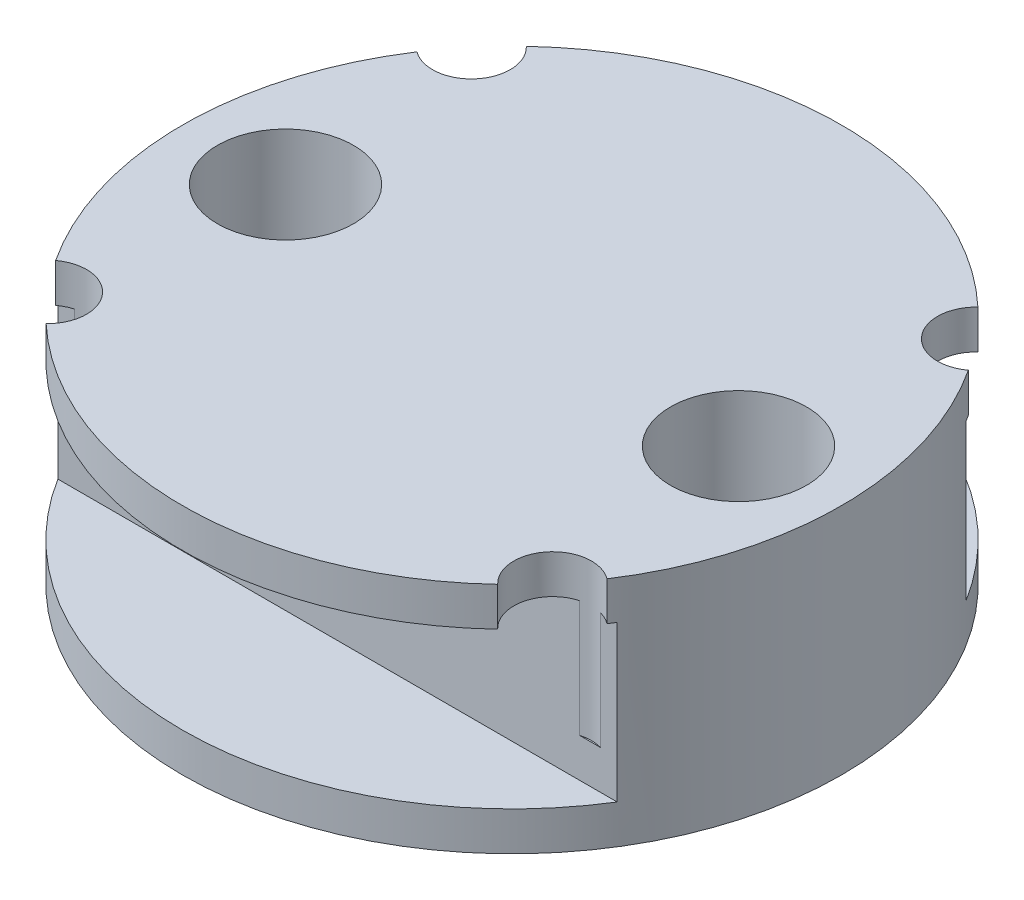
ISO-10303-21;
HEADER;
FILE_DESCRIPTION(('STEP AP214'),'2;1');
FILE_NAME('part.step','',(''),(''),'','','');
FILE_SCHEMA(('AUTOMOTIVE_DESIGN { 1 0 10303 214 1 1 1 1 }'));
ENDSEC;
DATA;
#1=APPLICATION_CONTEXT('core data for automotive mechanical design processes');
#2=APPLICATION_PROTOCOL_DEFINITION('international standard','automotive_design',2000,#1);
#3=PRODUCT_CONTEXT('',#1,'mechanical');
#4=PRODUCT('Part','Part','',(#3));
#5=PRODUCT_RELATED_PRODUCT_CATEGORY('part','',(#4));
#6=PRODUCT_DEFINITION_FORMATION('','',#4);
#7=PRODUCT_DEFINITION_CONTEXT('part definition',#1,'design');
#8=PRODUCT_DEFINITION('design','',#6,#7);
#9=PRODUCT_DEFINITION_SHAPE('','',#8);
#10=(LENGTH_UNIT() NAMED_UNIT(*) SI_UNIT(.MILLI.,.METRE.));
#11=(NAMED_UNIT(*) PLANE_ANGLE_UNIT() SI_UNIT($,.RADIAN.));
#12=(NAMED_UNIT(*) SI_UNIT($,.STERADIAN.) SOLID_ANGLE_UNIT());
#13=UNCERTAINTY_MEASURE_WITH_UNIT(LENGTH_MEASURE(1.E-05),#10,'distance_accuracy_value','');
#14=(GEOMETRIC_REPRESENTATION_CONTEXT(3) GLOBAL_UNCERTAINTY_ASSIGNED_CONTEXT((#13)) GLOBAL_UNIT_ASSIGNED_CONTEXT((#10,
#11,#12)) REPRESENTATION_CONTEXT('',''));
#15=CARTESIAN_POINT('',(0.,0.,0.));
#16=DIRECTION('',(0.,0.,1.));
#17=DIRECTION('',(1.,0.,0.));
#18=AXIS2_PLACEMENT_3D('',#15,#16,#17);
#19=CARTESIAN_POINT('',(-4.60785683521668,-6.,-9.96766779821957));
#20=DIRECTION('',(0.,1.,0.));
#21=DIRECTION('',(0.,0.,1.));
#22=AXIS2_PLACEMENT_3D('',#19,#20,#21);
#23=CYLINDRICAL_SURFACE('',#22,8.47778794644153);
#24=CARTESIAN_POINT('',(-4.60785683521668,0.,-9.96766779821957));
#25=DIRECTION('',(0.,1.,0.));
#26=DIRECTION('',(0.,0.,1.));
#27=AXIS2_PLACEMENT_3D('',#24,#25,#26);
#28=CIRCLE('',#27,8.47778794644153);
#29=CARTESIAN_POINT('',(1.19965729945594,0.,-16.14388573806));
#30=VERTEX_POINT('',#29);
#31=CARTESIAN_POINT('',(-10.4153709698893,0.,-16.14388573806));
#32=VERTEX_POINT('',#31);
#33=EDGE_CURVE('E262',#30,#32,#28,.T.);
#34=ORIENTED_EDGE('',*,*,#33,.F.);
#35=DIRECTION('',(0.,1.,0.));
#36=VECTOR('',#35,1.);
#37=CARTESIAN_POINT('',(1.19965729945594,-2.,-16.14388573806));
#38=LINE('',#37,#36);
#39=CARTESIAN_POINT('',(1.19965729945595,-1.,-16.14388573806));
#40=VERTEX_POINT('',#39);
#41=EDGE_CURVE('E330',#30,#40,#38,.F.);
#42=ORIENTED_EDGE('',*,*,#41,.T.);
#43=CARTESIAN_POINT('',(-4.60785683521668,-1.,-9.96766779821957));
#44=DIRECTION('',(0.,1.,0.));
#45=DIRECTION('',(-1.,0.,0.));
#46=AXIS2_PLACEMENT_3D('',#43,#44,#45);
#47=CIRCLE('',#46,8.47778794644153);
#48=CARTESIAN_POINT('',(-10.4153709698893,-1.,-16.14388573806));
#49=VERTEX_POINT('',#48);
#50=EDGE_CURVE('E284',#49,#40,#47,.F.);
#51=ORIENTED_EDGE('',*,*,#50,.F.);
#52=DIRECTION('',(0.,1.,0.));
#53=VECTOR('',#52,1.);
#54=CARTESIAN_POINT('',(-10.4153709698893,-2.,-16.14388573806));
#55=LINE('',#54,#53);
#56=EDGE_CURVE('E329',#32,#49,#55,.F.);
#57=ORIENTED_EDGE('',*,*,#56,.F.);
#58=EDGE_LOOP('',(#34,#42,#51,#57));
#59=FACE_BOUND('',#58,.T.);
#60=ADVANCED_FACE('F46',(#59),#23,.T.);
#61=CARTESIAN_POINT('',(-4.60785683521668,-6.,-9.96766779821957));
#62=DIRECTION('',(0.,1.,0.));
#63=DIRECTION('',(0.,0.,1.));
#64=AXIS2_PLACEMENT_3D('',#61,#62,#63);
#65=CIRCLE('',#64,8.47778794644153);
#66=CARTESIAN_POINT('',(-4.60785683521668,-6.,-1.48987985177805));
#67=VERTEX_POINT('',#66);
#68=EDGE_CURVE('E254',#67,#67,#65,.T.);
#69=ORIENTED_EDGE('',*,*,#68,.T.);
#70=EDGE_LOOP('',(#69));
#71=FACE_BOUND('',#70,.T.);
#72=CARTESIAN_POINT('',(2.48299472249213,-1.,-14.614463753646));
#73=VERTEX_POINT('',#72);
#74=CARTESIAN_POINT('',(2.59091414124397,-1.,-14.4454557446611));
#75=VERTEX_POINT('',#74);
#76=EDGE_CURVE('E279',#73,#75,#47,.F.);
#77=ORIENTED_EDGE('',*,*,#76,.F.);
#78=DIRECTION('',(0.,1.,0.));
#79=VECTOR('',#78,1.);
#80=CARTESIAN_POINT('',(2.48299472249213,-2.,-14.614463753646));
#81=LINE('',#80,#79);
#82=CARTESIAN_POINT('',(2.48299472249213,0.,-14.614463753646));
#83=VERTEX_POINT('',#82);
#84=EDGE_CURVE('E335',#73,#83,#81,.T.);
#85=ORIENTED_EDGE('',*,*,#84,.T.);
#86=CARTESIAN_POINT('',(2.48299472249214,0.,-5.32087184279311));
#87=VERTEX_POINT('',#86);
#88=EDGE_CURVE('E261',#87,#83,#28,.T.);
#89=ORIENTED_EDGE('',*,*,#88,.F.);
#90=DIRECTION('',(0.,1.,0.));
#91=VECTOR('',#90,1.);
#92=CARTESIAN_POINT('',(2.48299472249214,-2.,-5.32087184279311));
#93=LINE('',#92,#91);
#94=CARTESIAN_POINT('',(2.48299472249213,-1.,-5.32087184279311));
#95=VERTEX_POINT('',#94);
#96=EDGE_CURVE('E355',#95,#87,#93,.T.);
#97=ORIENTED_EDGE('',*,*,#96,.F.);
#98=CARTESIAN_POINT('',(-4.60785683521668,-1.,-9.96766779821957));
#99=DIRECTION('',(0.,-1.,0.));
#100=DIRECTION('',(0.,0.,-1.));
#101=AXIS2_PLACEMENT_3D('',#98,#99,#100);
#102=CIRCLE('',#101,8.47778794644153);
#103=CARTESIAN_POINT('',(2.58475925336002,-1.,-5.48));
#104=VERTEX_POINT('',#103);
#105=EDGE_CURVE('E271',#95,#104,#102,.F.);
#106=ORIENTED_EDGE('',*,*,#105,.T.);
#107=DIRECTION('',(0.,1.,0.));
#108=VECTOR('',#107,1.);
#109=CARTESIAN_POINT('',(2.58475925336002,-6.,-5.48));
#110=LINE('',#109,#108);
#111=CARTESIAN_POINT('',(2.58475925336002,-5.,-5.48));
#112=VERTEX_POINT('',#111);
#113=EDGE_CURVE('E275',#104,#112,#110,.F.);
#114=ORIENTED_EDGE('',*,*,#113,.T.);
#115=CARTESIAN_POINT('',(-4.60785683521668,-5.,-9.96766779821957));
#116=DIRECTION('',(0.,-1.,0.));
#117=DIRECTION('',(0.,0.,-1.));
#118=AXIS2_PLACEMENT_3D('',#115,#116,#117);
#119=CIRCLE('',#118,8.47778794644153);
#120=CARTESIAN_POINT('',(-11.8004729237934,-5.,-5.48));
#121=VERTEX_POINT('',#120);
#122=EDGE_CURVE('E269',#121,#112,#119,.F.);
#123=ORIENTED_EDGE('',*,*,#122,.F.);
#124=DIRECTION('',(0.,1.,0.));
#125=VECTOR('',#124,1.);
#126=CARTESIAN_POINT('',(-11.8004729237934,-6.,-5.48));
#127=LINE('',#126,#125);
#128=CARTESIAN_POINT('',(-11.8004729237934,-1.,-5.48));
#129=VERTEX_POINT('',#128);
#130=EDGE_CURVE('E257',#121,#129,#127,.T.);
#131=ORIENTED_EDGE('',*,*,#130,.T.);
#132=CARTESIAN_POINT('',(-11.6987083929255,-1.,-5.32087184279311));
#133=VERTEX_POINT('',#132);
#134=EDGE_CURVE('E272',#129,#133,#102,.F.);
#135=ORIENTED_EDGE('',*,*,#134,.T.);
#136=DIRECTION('',(0.,1.,0.));
#137=VECTOR('',#136,1.);
#138=CARTESIAN_POINT('',(-11.6987083929255,-2.,-5.32087184279311));
#139=LINE('',#138,#137);
#140=CARTESIAN_POINT('',(-11.6987083929255,0.,-5.32087184279311));
#141=VERTEX_POINT('',#140);
#142=EDGE_CURVE('E365',#133,#141,#139,.T.);
#143=ORIENTED_EDGE('',*,*,#142,.T.);
#144=CARTESIAN_POINT('',(-11.6987083929255,0.,-14.614463753646));
#145=VERTEX_POINT('',#144);
#146=EDGE_CURVE('E251',#145,#141,#28,.T.);
#147=ORIENTED_EDGE('',*,*,#146,.F.);
#148=DIRECTION('',(0.,1.,0.));
#149=VECTOR('',#148,1.);
#150=CARTESIAN_POINT('',(-11.6987083929255,-2.,-14.614463753646));
#151=LINE('',#150,#149);
#152=CARTESIAN_POINT('',(-11.6987083929255,-1.,-14.614463753646));
#153=VERTEX_POINT('',#152);
#154=EDGE_CURVE('E344',#153,#145,#151,.T.);
#155=ORIENTED_EDGE('',*,*,#154,.F.);
#156=CARTESIAN_POINT('',(-11.8066278116773,-1.,-14.4454557446611));
#157=VERTEX_POINT('',#156);
#158=EDGE_CURVE('E280',#157,#153,#47,.F.);
#159=ORIENTED_EDGE('',*,*,#158,.F.);
#160=DIRECTION('',(0.,1.,0.));
#161=VECTOR('',#160,1.);
#162=CARTESIAN_POINT('',(-11.8066278116773,-6.,-14.4454557446611));
#163=LINE('',#162,#161);
#164=CARTESIAN_POINT('',(-11.8066278116773,-5.,-14.4454557446611));
#165=VERTEX_POINT('',#164);
#166=EDGE_CURVE('E289',#157,#165,#163,.F.);
#167=ORIENTED_EDGE('',*,*,#166,.T.);
#168=CARTESIAN_POINT('',(-4.60785683521668,-5.,-9.96766779821957));
#169=DIRECTION('',(0.,-1.,0.));
#170=DIRECTION('',(1.,0.,0.));
#171=AXIS2_PLACEMENT_3D('',#168,#169,#170);
#172=CIRCLE('',#171,8.47778794644153);
#173=CARTESIAN_POINT('',(2.59091414124396,-5.,-14.4454557446611));
#174=VERTEX_POINT('',#173);
#175=EDGE_CURVE('E283',#174,#165,#172,.F.);
#176=ORIENTED_EDGE('',*,*,#175,.F.);
#177=DIRECTION('',(0.,1.,0.));
#178=VECTOR('',#177,1.);
#179=CARTESIAN_POINT('',(2.59091414124397,-6.,-14.4454557446611));
#180=LINE('',#179,#178);
#181=EDGE_CURVE('E286',#174,#75,#180,.T.);
#182=ORIENTED_EDGE('',*,*,#181,.T.);
#183=EDGE_LOOP('',(#77,#85,#89,#97,#106,#114,#123,#131,#135,#143,#147,#155,#159,#167,#176,#182));
#184=FACE_BOUND('',#183,.T.);
#185=ADVANCED_FACE('F386',(#71,#184),#23,.T.);
#186=CARTESIAN_POINT('',(-4.60785683521668,0.,-9.96766779821957));
#187=DIRECTION('',(0.,1.,0.));
#188=DIRECTION('',(0.,0.,1.));
#189=AXIS2_PLACEMENT_3D('',#186,#187,#188);
#190=PLANE('',#189);
#191=CARTESIAN_POINT('',(1.21853713800408,0.,-9.96766779821961));
#192=DIRECTION('',(0.,1.,0.));
#193=DIRECTION('',(0.,0.,1.));
#194=AXIS2_PLACEMENT_3D('',#191,#192,#193);
#195=CIRCLE('',#194,1.75);
#196=CARTESIAN_POINT('',(1.21853713800408,0.,-8.21766779821961));
#197=VERTEX_POINT('',#196);
#198=EDGE_CURVE('E245',#197,#197,#195,.T.);
#199=ORIENTED_EDGE('',*,*,#198,.F.);
#200=EDGE_LOOP('',(#199));
#201=FACE_BOUND('',#200,.T.);
#202=CARTESIAN_POINT('',(-10.4342508084374,0.,-9.96766779821957));
#203=DIRECTION('',(0.,1.,0.));
#204=DIRECTION('',(0.,0.,1.));
#205=AXIS2_PLACEMENT_3D('',#202,#203,#204);
#206=CIRCLE('',#205,1.75);
#207=CARTESIAN_POINT('',(-10.4342508084374,0.,-8.21766779821957));
#208=VERTEX_POINT('',#207);
#209=EDGE_CURVE('E244',#208,#208,#206,.T.);
#210=ORIENTED_EDGE('',*,*,#209,.F.);
#211=EDGE_LOOP('',(#210));
#212=FACE_BOUND('',#211,.T.);
#213=ORIENTED_EDGE('',*,*,#88,.T.);
#214=CARTESIAN_POINT('',(1.88650551109591,0.,-15.4170848477421));
#215=DIRECTION('',(0.,-1.,0.));
#216=DIRECTION('',(0.,0.,-1.));
#217=AXIS2_PLACEMENT_3D('',#214,#215,#216);
#218=CIRCLE('',#217,0.999999999999999);
#219=EDGE_CURVE('E190',#83,#30,#218,.T.);
#220=ORIENTED_EDGE('',*,*,#219,.T.);
#221=ORIENTED_EDGE('',*,*,#33,.T.);
#222=CARTESIAN_POINT('',(-11.1022191815293,0.,-15.4170848477421));
#223=DIRECTION('',(0.,1.,0.));
#224=DIRECTION('',(0.,0.,1.));
#225=AXIS2_PLACEMENT_3D('',#222,#223,#224);
#226=CIRCLE('',#225,0.999999999999999);
#227=EDGE_CURVE('E333',#145,#32,#226,.T.);
#228=ORIENTED_EDGE('',*,*,#227,.F.);
#229=ORIENTED_EDGE('',*,*,#146,.T.);
#230=CARTESIAN_POINT('',(-11.1022191815293,0.,-4.51825074869708));
#231=DIRECTION('',(0.,-1.,0.));
#232=DIRECTION('',(0.,0.,-1.));
#233=AXIS2_PLACEMENT_3D('',#230,#231,#232);
#234=CIRCLE('',#233,0.999999999999999);
#235=CARTESIAN_POINT('',(-10.4153709698893,0.,-3.79144985837913));
#236=VERTEX_POINT('',#235);
#237=EDGE_CURVE('E357',#141,#236,#234,.T.);
#238=ORIENTED_EDGE('',*,*,#237,.T.);
#239=CARTESIAN_POINT('',(1.19965729945594,0.,-3.79144985837913));
#240=VERTEX_POINT('',#239);
#241=EDGE_CURVE('E258',#236,#240,#28,.T.);
#242=ORIENTED_EDGE('',*,*,#241,.T.);
#243=CARTESIAN_POINT('',(1.88650551109591,0.,-4.51825074869708));
#244=DIRECTION('',(0.,1.,0.));
#245=DIRECTION('',(0.,0.,1.));
#246=AXIS2_PLACEMENT_3D('',#243,#244,#245);
#247=CIRCLE('',#246,0.999999999999999);
#248=EDGE_CURVE('E347',#87,#240,#247,.T.);
#249=ORIENTED_EDGE('',*,*,#248,.F.);
#250=EDGE_LOOP('',(#213,#220,#221,#228,#229,#238,#242,#249));
#251=FACE_BOUND('',#250,.T.);
#252=ADVANCED_FACE('F425',(#201,#212,#251),#190,.T.);
#253=CARTESIAN_POINT('',(-15.2975305659498,-1.,-14.4454557446611));
#254=DIRECTION('',(0.,1.,0.));
#255=DIRECTION('',(-1.,0.,0.));
#256=AXIS2_PLACEMENT_3D('',#253,#254,#255);
#257=PLANE('',#256);
#258=CARTESIAN_POINT('',(1.88650551109591,-1.,-15.4170848477421));
#259=DIRECTION('',(0.,1.,0.));
#260=DIRECTION('',(-1.,0.,0.));
#261=AXIS2_PLACEMENT_3D('',#258,#259,#260);
#262=CIRCLE('',#261,0.999999999999999);
#263=CARTESIAN_POINT('',(2.12301531225873,-1.,-14.4454557446611));
#264=VERTEX_POINT('',#263);
#265=EDGE_CURVE('E316',#73,#264,#262,.F.);
#266=ORIENTED_EDGE('',*,*,#265,.F.);
#267=ORIENTED_EDGE('',*,*,#76,.T.);
#268=DIRECTION('',(1.,0.,0.));
#269=VECTOR('',#268,1.);
#270=CARTESIAN_POINT('',(-15.2975305659498,-1.,-14.4454557446611));
#271=LINE('',#270,#269);
#272=EDGE_CURVE('E202',#264,#75,#271,.T.);
#273=ORIENTED_EDGE('',*,*,#272,.F.);
#274=EDGE_LOOP('',(#266,#267,#273));
#275=FACE_BOUND('',#274,.T.);
#276=ADVANCED_FACE('F315',(#275),#257,.F.);
#277=CARTESIAN_POINT('',(1.6499957099331,-1.,-14.4454557446611));
#278=VERTEX_POINT('',#277);
#279=EDGE_CURVE('E323',#278,#40,#262,.F.);
#280=ORIENTED_EDGE('',*,*,#279,.F.);
#281=CARTESIAN_POINT('',(-10.8657093803665,-1.,-14.4454557446611));
#282=VERTEX_POINT('',#281);
#283=EDGE_CURVE('E196',#282,#278,#271,.T.);
#284=ORIENTED_EDGE('',*,*,#283,.F.);
#285=CARTESIAN_POINT('',(-11.1022191815293,-1.,-15.4170848477421));
#286=DIRECTION('',(0.,1.,0.));
#287=DIRECTION('',(-1.,0.,0.));
#288=AXIS2_PLACEMENT_3D('',#285,#286,#287);
#289=CIRCLE('',#288,0.999999999999999);
#290=EDGE_CURVE('E324',#282,#49,#289,.T.);
#291=ORIENTED_EDGE('',*,*,#290,.T.);
#292=ORIENTED_EDGE('',*,*,#50,.T.);
#293=EDGE_LOOP('',(#280,#284,#291,#292));
#294=FACE_BOUND('',#293,.T.);
#295=ADVANCED_FACE('F322',(#294),#257,.F.);
#296=CARTESIAN_POINT('',(0.,0.,-14.4454557446611));
#297=DIRECTION('',(0.,0.,-1.));
#298=DIRECTION('',(-1.,0.,0.));
#299=AXIS2_PLACEMENT_3D('',#296,#297,#298);
#300=PLANE('',#299);
#301=ORIENTED_EDGE('',*,*,#283,.T.);
#302=DIRECTION('',(0.,1.,0.));
#303=VECTOR('',#302,1.);
#304=CARTESIAN_POINT('',(1.6499957099331,-4.,-14.4454557446611));
#305=LINE('',#304,#303);
#306=CARTESIAN_POINT('',(1.6499957099331,-4.,-14.4454557446611));
#307=VERTEX_POINT('',#306);
#308=EDGE_CURVE('E13',#278,#307,#305,.F.);
#309=ORIENTED_EDGE('',*,*,#308,.T.);
#310=DIRECTION('',(-1.,0.,0.));
#311=VECTOR('',#310,1.);
#312=CARTESIAN_POINT('',(0.,-4.,-14.4454557446611));
#313=LINE('',#312,#311);
#314=CARTESIAN_POINT('',(2.12301531225873,-4.,-14.4454557446611));
#315=VERTEX_POINT('',#314);
#316=EDGE_CURVE('E181',#315,#307,#313,.T.);
#317=ORIENTED_EDGE('',*,*,#316,.F.);
#318=DIRECTION('',(0.,1.,0.));
#319=VECTOR('',#318,1.);
#320=CARTESIAN_POINT('',(2.12301531225873,-4.,-14.4454557446611));
#321=LINE('',#320,#319);
#322=EDGE_CURVE('E54',#315,#264,#321,.T.);
#323=ORIENTED_EDGE('',*,*,#322,.T.);
#324=ORIENTED_EDGE('',*,*,#272,.T.);
#325=ORIENTED_EDGE('',*,*,#181,.F.);
#326=DIRECTION('',(-1.,0.,0.));
#327=VECTOR('',#326,1.);
#328=CARTESIAN_POINT('',(-15.2975305659498,-5.,-14.4454557446611));
#329=LINE('',#328,#327);
#330=EDGE_CURVE('E205',#174,#165,#329,.T.);
#331=ORIENTED_EDGE('',*,*,#330,.T.);
#332=ORIENTED_EDGE('',*,*,#166,.F.);
#333=CARTESIAN_POINT('',(-11.3387289826921,-1.,-14.4454557446611));
#334=VERTEX_POINT('',#333);
#335=EDGE_CURVE('E201',#157,#334,#271,.T.);
#336=ORIENTED_EDGE('',*,*,#335,.T.);
#337=DIRECTION('',(0.,1.,0.));
#338=VECTOR('',#337,1.);
#339=CARTESIAN_POINT('',(-11.3387289826921,-4.,-14.4454557446611));
#340=LINE('',#339,#338);
#341=CARTESIAN_POINT('',(-11.3387289826921,-4.,-14.4454557446611));
#342=VERTEX_POINT('',#341);
#343=EDGE_CURVE('E185',#342,#334,#340,.T.);
#344=ORIENTED_EDGE('',*,*,#343,.F.);
#345=DIRECTION('',(1.,0.,0.));
#346=VECTOR('',#345,1.);
#347=CARTESIAN_POINT('',(0.,-4.,-14.4454557446611));
#348=LINE('',#347,#346);
#349=CARTESIAN_POINT('',(-10.8657093803665,-4.,-14.4454557446611));
#350=VERTEX_POINT('',#349);
#351=EDGE_CURVE('E308',#342,#350,#348,.T.);
#352=ORIENTED_EDGE('',*,*,#351,.T.);
#353=DIRECTION('',(0.,1.,0.));
#354=VECTOR('',#353,1.);
#355=CARTESIAN_POINT('',(-10.8657093803665,-4.,-14.4454557446611));
#356=LINE('',#355,#354);
#357=EDGE_CURVE('E198',#282,#350,#356,.F.);
#358=ORIENTED_EDGE('',*,*,#357,.F.);
#359=EDGE_LOOP('',(#301,#309,#317,#323,#324,#325,#331,#332,#336,#344,#352,#358));
#360=FACE_BOUND('',#359,.T.);
#361=ADVANCED_FACE('F193',(#360),#300,.T.);
#362=ORIENTED_EDGE('',*,*,#158,.T.);
#363=EDGE_CURVE('E342',#153,#334,#289,.T.);
#364=ORIENTED_EDGE('',*,*,#363,.T.);
#365=ORIENTED_EDGE('',*,*,#335,.F.);
#366=EDGE_LOOP('',(#362,#364,#365));
#367=FACE_BOUND('',#366,.T.);
#368=ADVANCED_FACE('F433',(#367),#257,.F.);
#369=CARTESIAN_POINT('',(-15.0747472411981,-1.,-5.48));
#370=DIRECTION('',(0.,-1.,0.));
#371=DIRECTION('',(0.,0.,-1.));
#372=AXIS2_PLACEMENT_3D('',#369,#370,#371);
#373=PLANE('',#372);
#374=CARTESIAN_POINT('',(1.88650551109591,-1.,-4.51825074869708));
#375=DIRECTION('',(0.,-1.,0.));
#376=DIRECTION('',(0.,0.,-1.));
#377=AXIS2_PLACEMENT_3D('',#374,#375,#376);
#378=CIRCLE('',#377,0.999999999999999);
#379=CARTESIAN_POINT('',(2.16043684851146,-1.,-5.48));
#380=VERTEX_POINT('',#379);
#381=EDGE_CURVE('E353',#380,#95,#378,.T.);
#382=ORIENTED_EDGE('',*,*,#381,.F.);
#383=DIRECTION('',(1.,0.,0.));
#384=VECTOR('',#383,1.);
#385=CARTESIAN_POINT('',(-15.0747472411981,-1.,-5.48));
#386=LINE('',#385,#384);
#387=EDGE_CURVE('E216',#380,#104,#386,.T.);
#388=ORIENTED_EDGE('',*,*,#387,.T.);
#389=ORIENTED_EDGE('',*,*,#105,.F.);
#390=EDGE_LOOP('',(#382,#388,#389));
#391=FACE_BOUND('',#390,.T.);
#392=ADVANCED_FACE('F393',(#391),#373,.T.);
#393=DIRECTION('',(0.,1.,0.));
#394=VECTOR('',#393,1.);
#395=CARTESIAN_POINT('',(1.19965729945594,-2.,-3.79144985837913));
#396=LINE('',#395,#394);
#397=CARTESIAN_POINT('',(1.19965729945595,-1.,-3.79144985837913));
#398=VERTEX_POINT('',#397);
#399=EDGE_CURVE('E352',#240,#398,#396,.F.);
#400=ORIENTED_EDGE('',*,*,#399,.F.);
#401=ORIENTED_EDGE('',*,*,#241,.F.);
#402=DIRECTION('',(0.,1.,0.));
#403=VECTOR('',#402,1.);
#404=CARTESIAN_POINT('',(-10.4153709698893,-2.,-3.79144985837913));
#405=LINE('',#404,#403);
#406=CARTESIAN_POINT('',(-10.4153709698893,-1.,-3.79144985837913));
#407=VERTEX_POINT('',#406);
#408=EDGE_CURVE('E207',#236,#407,#405,.F.);
#409=ORIENTED_EDGE('',*,*,#408,.T.);
#410=EDGE_CURVE('E276',#407,#398,#102,.F.);
#411=ORIENTED_EDGE('',*,*,#410,.T.);
#412=EDGE_LOOP('',(#400,#401,#409,#411));
#413=FACE_BOUND('',#412,.T.);
#414=ADVANCED_FACE('F48',(#413),#23,.T.);
#415=CARTESIAN_POINT('',(-11.3761505189448,-1.,-5.48));
#416=VERTEX_POINT('',#415);
#417=EDGE_CURVE('E217',#129,#416,#386,.T.);
#418=ORIENTED_EDGE('',*,*,#417,.T.);
#419=CARTESIAN_POINT('',(-11.1022191815293,-1.,-4.51825074869708));
#420=DIRECTION('',(0.,-1.,0.));
#421=DIRECTION('',(0.,0.,-1.));
#422=AXIS2_PLACEMENT_3D('',#419,#420,#421);
#423=CIRCLE('',#422,0.999999999999999);
#424=EDGE_CURVE('E361',#416,#133,#423,.F.);
#425=ORIENTED_EDGE('',*,*,#424,.T.);
#426=ORIENTED_EDGE('',*,*,#134,.F.);
#427=EDGE_LOOP('',(#418,#425,#426));
#428=FACE_BOUND('',#427,.T.);
#429=ADVANCED_FACE('F402',(#428),#373,.T.);
#430=CARTESIAN_POINT('',(1.61257417368036,-1.,-5.48));
#431=VERTEX_POINT('',#430);
#432=EDGE_CURVE('E349',#398,#431,#378,.T.);
#433=ORIENTED_EDGE('',*,*,#432,.F.);
#434=ORIENTED_EDGE('',*,*,#410,.F.);
#435=CARTESIAN_POINT('',(-10.8282878441137,-1.,-5.48));
#436=VERTEX_POINT('',#435);
#437=EDGE_CURVE('E366',#407,#436,#423,.F.);
#438=ORIENTED_EDGE('',*,*,#437,.T.);
#439=EDGE_CURVE('E221',#436,#431,#386,.T.);
#440=ORIENTED_EDGE('',*,*,#439,.T.);
#441=EDGE_LOOP('',(#433,#434,#438,#440));
#442=FACE_BOUND('',#441,.T.);
#443=ADVANCED_FACE('F382',(#442),#373,.T.);
#444=CARTESIAN_POINT('',(0.,0.,-5.48));
#445=DIRECTION('',(0.,0.,1.));
#446=DIRECTION('',(1.,0.,0.));
#447=AXIS2_PLACEMENT_3D('',#444,#445,#446);
#448=PLANE('',#447);
#449=DIRECTION('',(0.,1.,0.));
#450=VECTOR('',#449,1.);
#451=CARTESIAN_POINT('',(2.16043684851146,-4.,-5.48));
#452=LINE('',#451,#450);
#453=CARTESIAN_POINT('',(2.16043684851146,-4.,-5.48));
#454=VERTEX_POINT('',#453);
#455=EDGE_CURVE('E306',#454,#380,#452,.T.);
#456=ORIENTED_EDGE('',*,*,#455,.F.);
#457=DIRECTION('',(-1.,0.,0.));
#458=VECTOR('',#457,1.);
#459=CARTESIAN_POINT('',(0.,-4.,-5.48));
#460=LINE('',#459,#458);
#461=CARTESIAN_POINT('',(1.61257417368036,-4.,-5.48));
#462=VERTEX_POINT('',#461);
#463=EDGE_CURVE('E300',#454,#462,#460,.T.);
#464=ORIENTED_EDGE('',*,*,#463,.T.);
#465=DIRECTION('',(0.,1.,0.));
#466=VECTOR('',#465,1.);
#467=CARTESIAN_POINT('',(1.61257417368036,-4.,-5.48));
#468=LINE('',#467,#466);
#469=EDGE_CURVE('E303',#431,#462,#468,.F.);
#470=ORIENTED_EDGE('',*,*,#469,.F.);
#471=ORIENTED_EDGE('',*,*,#439,.F.);
#472=DIRECTION('',(0.,1.,0.));
#473=VECTOR('',#472,1.);
#474=CARTESIAN_POINT('',(-10.8282878441137,-4.,-5.48));
#475=LINE('',#474,#473);
#476=CARTESIAN_POINT('',(-10.8282878441137,-4.,-5.48));
#477=VERTEX_POINT('',#476);
#478=EDGE_CURVE('E297',#436,#477,#475,.F.);
#479=ORIENTED_EDGE('',*,*,#478,.T.);
#480=DIRECTION('',(1.,0.,0.));
#481=VECTOR('',#480,1.);
#482=CARTESIAN_POINT('',(0.,-4.,-5.48));
#483=LINE('',#482,#481);
#484=CARTESIAN_POINT('',(-11.3761505189448,-4.,-5.48));
#485=VERTEX_POINT('',#484);
#486=EDGE_CURVE('E292',#485,#477,#483,.T.);
#487=ORIENTED_EDGE('',*,*,#486,.F.);
#488=DIRECTION('',(0.,1.,0.));
#489=VECTOR('',#488,1.);
#490=CARTESIAN_POINT('',(-11.3761505189448,-4.,-5.48));
#491=LINE('',#490,#489);
#492=EDGE_CURVE('E294',#485,#416,#491,.T.);
#493=ORIENTED_EDGE('',*,*,#492,.T.);
#494=ORIENTED_EDGE('',*,*,#417,.F.);
#495=ORIENTED_EDGE('',*,*,#130,.F.);
#496=DIRECTION('',(1.,0.,0.));
#497=VECTOR('',#496,1.);
#498=CARTESIAN_POINT('',(-15.0747472411981,-5.,-5.48));
#499=LINE('',#498,#497);
#500=EDGE_CURVE('E213',#121,#112,#499,.T.);
#501=ORIENTED_EDGE('',*,*,#500,.T.);
#502=ORIENTED_EDGE('',*,*,#113,.F.);
#503=ORIENTED_EDGE('',*,*,#387,.F.);
#504=EDGE_LOOP('',(#456,#464,#470,#471,#479,#487,#493,#494,#495,#501,#502,#503));
#505=FACE_BOUND('',#504,.T.);
#506=ADVANCED_FACE('F396',(#505),#448,.T.);
#507=CARTESIAN_POINT('',(-4.60785683521668,-6.,-9.96766779821957));
#508=DIRECTION('',(0.,1.,0.));
#509=DIRECTION('',(0.,0.,1.));
#510=AXIS2_PLACEMENT_3D('',#507,#508,#509);
#511=PLANE('',#510);
#512=CARTESIAN_POINT('',(-10.4342508084374,-6.,-9.96766779821957));
#513=DIRECTION('',(0.,-1.,0.));
#514=DIRECTION('',(0.,0.,-1.));
#515=AXIS2_PLACEMENT_3D('',#512,#513,#514);
#516=CIRCLE('',#515,2.);
#517=CARTESIAN_POINT('',(-10.4342508084374,-6.,-11.9676677982196));
#518=VERTEX_POINT('',#517);
#519=EDGE_CURVE('E220',#518,#518,#516,.T.);
#520=ORIENTED_EDGE('',*,*,#519,.F.);
#521=EDGE_LOOP('',(#520));
#522=FACE_BOUND('',#521,.T.);
#523=CARTESIAN_POINT('',(1.21853713800408,-6.,-9.96766779821961));
#524=DIRECTION('',(0.,-1.,0.));
#525=DIRECTION('',(0.,0.,-1.));
#526=AXIS2_PLACEMENT_3D('',#523,#524,#525);
#527=CIRCLE('',#526,2.);
#528=CARTESIAN_POINT('',(1.21853713800408,-6.,-11.9676677982196));
#529=VERTEX_POINT('',#528);
#530=EDGE_CURVE('E231',#529,#529,#527,.T.);
#531=ORIENTED_EDGE('',*,*,#530,.F.);
#532=EDGE_LOOP('',(#531));
#533=FACE_BOUND('',#532,.T.);
#534=ORIENTED_EDGE('',*,*,#68,.F.);
#535=EDGE_LOOP('',(#534));
#536=FACE_BOUND('',#535,.T.);
#537=ADVANCED_FACE('F445',(#522,#533,#536),#511,.F.);
#538=CARTESIAN_POINT('',(-10.4342508084374,-3.,-9.96766779821957));
#539=DIRECTION('',(0.,1.,0.));
#540=DIRECTION('',(0.,0.,1.));
#541=AXIS2_PLACEMENT_3D('',#538,#539,#540);
#542=CYLINDRICAL_SURFACE('',#541,1.75);
#543=CARTESIAN_POINT('',(-10.4342508084374,-3.,-9.96766779821957));
#544=DIRECTION('',(0.,1.,0.));
#545=DIRECTION('',(0.,0.,1.));
#546=AXIS2_PLACEMENT_3D('',#543,#544,#545);
#547=CIRCLE('',#546,1.75);
#548=CARTESIAN_POINT('',(-10.4342508084374,-3.,-8.21766779821957));
#549=VERTEX_POINT('',#548);
#550=EDGE_CURVE('E248',#549,#549,#547,.T.);
#551=ORIENTED_EDGE('',*,*,#550,.F.);
#552=EDGE_LOOP('',(#551));
#553=FACE_BOUND('',#552,.T.);
#554=ORIENTED_EDGE('',*,*,#209,.T.);
#555=EDGE_LOOP('',(#554));
#556=FACE_BOUND('',#555,.T.);
#557=ADVANCED_FACE('F449',(#553,#556),#542,.F.);
#558=CARTESIAN_POINT('',(-10.4342508084374,-3.,-9.96766779821957));
#559=DIRECTION('',(0.,1.,0.));
#560=DIRECTION('',(0.,0.,1.));
#561=AXIS2_PLACEMENT_3D('',#558,#559,#560);
#562=PLANE('',#561);
#563=CARTESIAN_POINT('',(-10.4342508084374,-3.,-9.96766779821957));
#564=DIRECTION('',(0.,1.,0.));
#565=DIRECTION('',(0.,0.,1.));
#566=AXIS2_PLACEMENT_3D('',#563,#564,#565);
#567=CIRCLE('',#566,0.75);
#568=CARTESIAN_POINT('',(-10.4342508084374,-3.,-9.21766779821957));
#569=VERTEX_POINT('',#568);
#570=EDGE_CURVE('E230',#569,#569,#567,.T.);
#571=ORIENTED_EDGE('',*,*,#570,.F.);
#572=EDGE_LOOP('',(#571));
#573=FACE_BOUND('',#572,.T.);
#574=ORIENTED_EDGE('',*,*,#550,.T.);
#575=EDGE_LOOP('',(#574));
#576=FACE_BOUND('',#575,.T.);
#577=ADVANCED_FACE('F574',(#573,#576),#562,.T.);
#578=CARTESIAN_POINT('',(1.21853713800408,-3.,-9.96766779821961));
#579=DIRECTION('',(0.,1.,0.));
#580=DIRECTION('',(0.,0.,1.));
#581=AXIS2_PLACEMENT_3D('',#578,#579,#580);
#582=CYLINDRICAL_SURFACE('',#581,1.75);
#583=CARTESIAN_POINT('',(1.21853713800408,-3.,-9.96766779821961));
#584=DIRECTION('',(0.,1.,0.));
#585=DIRECTION('',(0.,0.,1.));
#586=AXIS2_PLACEMENT_3D('',#583,#584,#585);
#587=CIRCLE('',#586,1.75);
#588=CARTESIAN_POINT('',(1.21853713800408,-3.,-8.21766779821961));
#589=VERTEX_POINT('',#588);
#590=EDGE_CURVE('E241',#589,#589,#587,.T.);
#591=ORIENTED_EDGE('',*,*,#590,.F.);
#592=EDGE_LOOP('',(#591));
#593=FACE_BOUND('',#592,.T.);
#594=ORIENTED_EDGE('',*,*,#198,.T.);
#595=EDGE_LOOP('',(#594));
#596=FACE_BOUND('',#595,.T.);
#597=ADVANCED_FACE('F566',(#593,#596),#582,.F.);
#598=CARTESIAN_POINT('',(1.21853713800408,-3.,-9.96766779821961));
#599=DIRECTION('',(0.,1.,0.));
#600=DIRECTION('',(0.,0.,1.));
#601=AXIS2_PLACEMENT_3D('',#598,#599,#600);
#602=PLANE('',#601);
#603=CARTESIAN_POINT('',(1.21853713800408,-3.,-9.96766779821961));
#604=DIRECTION('',(0.,1.,0.));
#605=DIRECTION('',(0.,0.,1.));
#606=AXIS2_PLACEMENT_3D('',#603,#604,#605);
#607=CIRCLE('',#606,0.749999999999999);
#608=CARTESIAN_POINT('',(1.21853713800408,-3.,-9.21766779821961));
#609=VERTEX_POINT('',#608);
#610=EDGE_CURVE('E240',#609,#609,#607,.T.);
#611=ORIENTED_EDGE('',*,*,#610,.F.);
#612=EDGE_LOOP('',(#611));
#613=FACE_BOUND('',#612,.T.);
#614=ORIENTED_EDGE('',*,*,#590,.T.);
#615=EDGE_LOOP('',(#614));
#616=FACE_BOUND('',#615,.T.);
#617=ADVANCED_FACE('F556',(#613,#616),#602,.T.);
#618=CARTESIAN_POINT('',(1.21853713800408,-6.,-9.96766779821961));
#619=DIRECTION('',(0.,-1.,0.));
#620=DIRECTION('',(0.,0.,-1.));
#621=AXIS2_PLACEMENT_3D('',#618,#619,#620);
#622=CYLINDRICAL_SURFACE('',#621,0.749999999999999);
#623=ORIENTED_EDGE('',*,*,#610,.T.);
#624=EDGE_LOOP('',(#623));
#625=FACE_BOUND('',#624,.T.);
#626=CARTESIAN_POINT('',(1.21853713800408,-5.,-9.96766779821961));
#627=DIRECTION('',(0.,-1.,0.));
#628=DIRECTION('',(0.,0.,-1.));
#629=AXIS2_PLACEMENT_3D('',#626,#627,#628);
#630=CIRCLE('',#629,0.75);
#631=CARTESIAN_POINT('',(1.21853713800408,-5.,-10.7176677982196));
#632=VERTEX_POINT('',#631);
#633=EDGE_CURVE('E237',#632,#632,#630,.T.);
#634=ORIENTED_EDGE('',*,*,#633,.T.);
#635=EDGE_LOOP('',(#634));
#636=FACE_BOUND('',#635,.T.);
#637=ADVANCED_FACE('F546',(#625,#636),#622,.F.);
#638=CARTESIAN_POINT('',(1.96853713800408,-5.,-9.96766779821961));
#639=DIRECTION('',(0.,1.,0.));
#640=DIRECTION('',(0.,0.,1.));
#641=AXIS2_PLACEMENT_3D('',#638,#639,#640);
#642=PLANE('',#641);
#643=ORIENTED_EDGE('',*,*,#633,.F.);
#644=EDGE_LOOP('',(#643));
#645=FACE_BOUND('',#644,.T.);
#646=CARTESIAN_POINT('',(1.21853713800408,-5.,-9.96766779821961));
#647=DIRECTION('',(0.,-1.,0.));
#648=DIRECTION('',(0.,0.,-1.));
#649=AXIS2_PLACEMENT_3D('',#646,#647,#648);
#650=CIRCLE('',#649,2.);
#651=CARTESIAN_POINT('',(1.21853713800408,-5.,-11.9676677982196));
#652=VERTEX_POINT('',#651);
#653=EDGE_CURVE('E234',#652,#652,#650,.T.);
#654=ORIENTED_EDGE('',*,*,#653,.T.);
#655=EDGE_LOOP('',(#654));
#656=FACE_BOUND('',#655,.T.);
#657=ADVANCED_FACE('F536',(#645,#656),#642,.F.);
#658=CARTESIAN_POINT('',(1.21853713800408,-6.,-9.96766779821961));
#659=DIRECTION('',(0.,-1.,0.));
#660=DIRECTION('',(0.,0.,-1.));
#661=AXIS2_PLACEMENT_3D('',#658,#659,#660);
#662=CYLINDRICAL_SURFACE('',#661,2.);
#663=ORIENTED_EDGE('',*,*,#653,.F.);
#664=EDGE_LOOP('',(#663));
#665=FACE_BOUND('',#664,.T.);
#666=ORIENTED_EDGE('',*,*,#530,.T.);
#667=EDGE_LOOP('',(#666));
#668=FACE_BOUND('',#667,.T.);
#669=ADVANCED_FACE('F526',(#665,#668),#662,.F.);
#670=CARTESIAN_POINT('',(-10.4342508084374,-6.,-9.96766779821957));
#671=DIRECTION('',(0.,-1.,0.));
#672=DIRECTION('',(0.,0.,-1.));
#673=AXIS2_PLACEMENT_3D('',#670,#671,#672);
#674=CYLINDRICAL_SURFACE('',#673,0.75);
#675=ORIENTED_EDGE('',*,*,#570,.T.);
#676=EDGE_LOOP('',(#675));
#677=FACE_BOUND('',#676,.T.);
#678=CARTESIAN_POINT('',(-10.4342508084374,-5.,-9.96766779821957));
#679=DIRECTION('',(0.,-1.,0.));
#680=DIRECTION('',(0.,0.,-1.));
#681=AXIS2_PLACEMENT_3D('',#678,#679,#680);
#682=CIRCLE('',#681,0.750000000000001);
#683=CARTESIAN_POINT('',(-10.4342508084374,-5.,-10.7176677982196));
#684=VERTEX_POINT('',#683);
#685=EDGE_CURVE('E227',#684,#684,#682,.T.);
#686=ORIENTED_EDGE('',*,*,#685,.T.);
#687=EDGE_LOOP('',(#686));
#688=FACE_BOUND('',#687,.T.);
#689=ADVANCED_FACE('F516',(#677,#688),#674,.F.);
#690=CARTESIAN_POINT('',(-9.68425080843744,-5.,-9.96766779821957));
#691=DIRECTION('',(0.,1.,0.));
#692=DIRECTION('',(0.,0.,1.));
#693=AXIS2_PLACEMENT_3D('',#690,#691,#692);
#694=PLANE('',#693);
#695=ORIENTED_EDGE('',*,*,#685,.F.);
#696=EDGE_LOOP('',(#695));
#697=FACE_BOUND('',#696,.T.);
#698=CARTESIAN_POINT('',(-10.4342508084374,-5.,-9.96766779821957));
#699=DIRECTION('',(0.,-1.,0.));
#700=DIRECTION('',(0.,0.,-1.));
#701=AXIS2_PLACEMENT_3D('',#698,#699,#700);
#702=CIRCLE('',#701,2.);
#703=CARTESIAN_POINT('',(-10.4342508084374,-5.,-11.9676677982196));
#704=VERTEX_POINT('',#703);
#705=EDGE_CURVE('E224',#704,#704,#702,.T.);
#706=ORIENTED_EDGE('',*,*,#705,.T.);
#707=EDGE_LOOP('',(#706));
#708=FACE_BOUND('',#707,.T.);
#709=ADVANCED_FACE('F506',(#697,#708),#694,.F.);
#710=CARTESIAN_POINT('',(-10.4342508084374,-6.,-9.96766779821957));
#711=DIRECTION('',(0.,-1.,0.));
#712=DIRECTION('',(0.,0.,-1.));
#713=AXIS2_PLACEMENT_3D('',#710,#711,#712);
#714=CYLINDRICAL_SURFACE('',#713,2.);
#715=ORIENTED_EDGE('',*,*,#705,.F.);
#716=EDGE_LOOP('',(#715));
#717=FACE_BOUND('',#716,.T.);
#718=ORIENTED_EDGE('',*,*,#519,.T.);
#719=EDGE_LOOP('',(#718));
#720=FACE_BOUND('',#719,.T.);
#721=ADVANCED_FACE('F498',(#717,#720),#714,.F.);
#722=CARTESIAN_POINT('',(-15.0747472411981,-5.,-5.48));
#723=DIRECTION('',(0.,-1.,0.));
#724=DIRECTION('',(0.,0.,-1.));
#725=AXIS2_PLACEMENT_3D('',#722,#723,#724);
#726=PLANE('',#725);
#727=ORIENTED_EDGE('',*,*,#122,.T.);
#728=ORIENTED_EDGE('',*,*,#500,.F.);
#729=EDGE_LOOP('',(#727,#728));
#730=FACE_BOUND('',#729,.T.);
#731=ADVANCED_FACE('F399',(#730),#726,.F.);
#732=CARTESIAN_POINT('',(-15.2975305659498,-5.,-14.4454557446611));
#733=DIRECTION('',(0.,-1.,0.));
#734=DIRECTION('',(1.,0.,0.));
#735=AXIS2_PLACEMENT_3D('',#732,#733,#734);
#736=PLANE('',#735);
#737=ORIENTED_EDGE('',*,*,#330,.F.);
#738=ORIENTED_EDGE('',*,*,#175,.T.);
#739=EDGE_LOOP('',(#737,#738));
#740=FACE_BOUND('',#739,.T.);
#741=ADVANCED_FACE('F418',(#740),#736,.F.);
#742=CARTESIAN_POINT('',(-11.1022191815293,-4.,-4.51825074869708));
#743=DIRECTION('',(0.,1.,0.));
#744=DIRECTION('',(0.,0.,1.));
#745=AXIS2_PLACEMENT_3D('',#742,#743,#744);
#746=CYLINDRICAL_SURFACE('',#745,0.999999999999999);
#747=ORIENTED_EDGE('',*,*,#237,.F.);
#748=ORIENTED_EDGE('',*,*,#142,.F.);
#749=ORIENTED_EDGE('',*,*,#424,.F.);
#750=ORIENTED_EDGE('',*,*,#492,.F.);
#751=CARTESIAN_POINT('',(-11.1022191815293,-4.,-4.51825074869708));
#752=DIRECTION('',(0.,-1.,0.));
#753=DIRECTION('',(0.,0.,-1.));
#754=AXIS2_PLACEMENT_3D('',#751,#752,#753);
#755=CIRCLE('',#754,0.999999999999999);
#756=EDGE_CURVE('E358',#485,#477,#755,.T.);
#757=ORIENTED_EDGE('',*,*,#756,.T.);
#758=ORIENTED_EDGE('',*,*,#478,.F.);
#759=ORIENTED_EDGE('',*,*,#437,.F.);
#760=ORIENTED_EDGE('',*,*,#408,.F.);
#761=EDGE_LOOP('',(#747,#748,#749,#750,#757,#758,#759,#760));
#762=FACE_BOUND('',#761,.T.);
#763=ADVANCED_FACE('F404',(#762),#746,.F.);
#764=CARTESIAN_POINT('',(-11.1022191815293,-4.,-4.51825074869708));
#765=DIRECTION('',(0.,-1.,0.));
#766=DIRECTION('',(0.,0.,-1.));
#767=AXIS2_PLACEMENT_3D('',#764,#765,#766);
#768=PLANE('',#767);
#769=ORIENTED_EDGE('',*,*,#486,.T.);
#770=ORIENTED_EDGE('',*,*,#756,.F.);
#771=EDGE_LOOP('',(#769,#770));
#772=FACE_BOUND('',#771,.T.);
#773=ADVANCED_FACE('F407',(#772),#768,.F.);
#774=CARTESIAN_POINT('',(1.88650551109591,-4.,-4.51825074869708));
#775=DIRECTION('',(0.,1.,0.));
#776=DIRECTION('',(0.,0.,1.));
#777=AXIS2_PLACEMENT_3D('',#774,#775,#776);
#778=CYLINDRICAL_SURFACE('',#777,0.999999999999999);
#779=ORIENTED_EDGE('',*,*,#96,.T.);
#780=ORIENTED_EDGE('',*,*,#248,.T.);
#781=ORIENTED_EDGE('',*,*,#399,.T.);
#782=ORIENTED_EDGE('',*,*,#432,.T.);
#783=ORIENTED_EDGE('',*,*,#469,.T.);
#784=CARTESIAN_POINT('',(1.88650551109591,-4.,-4.51825074869708));
#785=DIRECTION('',(0.,1.,0.));
#786=DIRECTION('',(0.,0.,1.));
#787=AXIS2_PLACEMENT_3D('',#784,#785,#786);
#788=CIRCLE('',#787,0.999999999999999);
#789=EDGE_CURVE('E346',#454,#462,#788,.T.);
#790=ORIENTED_EDGE('',*,*,#789,.F.);
#791=ORIENTED_EDGE('',*,*,#455,.T.);
#792=ORIENTED_EDGE('',*,*,#381,.T.);
#793=EDGE_LOOP('',(#779,#780,#781,#782,#783,#790,#791,#792));
#794=FACE_BOUND('',#793,.T.);
#795=ADVANCED_FACE('F409',(#794),#778,.F.);
#796=CARTESIAN_POINT('',(1.88650551109591,-4.,-4.51825074869708));
#797=DIRECTION('',(0.,1.,0.));
#798=DIRECTION('',(0.,0.,1.));
#799=AXIS2_PLACEMENT_3D('',#796,#797,#798);
#800=PLANE('',#799);
#801=ORIENTED_EDGE('',*,*,#789,.T.);
#802=ORIENTED_EDGE('',*,*,#463,.F.);
#803=EDGE_LOOP('',(#801,#802));
#804=FACE_BOUND('',#803,.T.);
#805=ADVANCED_FACE('F415',(#804),#800,.T.);
#806=CARTESIAN_POINT('',(-11.1022191815293,-4.,-15.4170848477421));
#807=DIRECTION('',(0.,1.,0.));
#808=DIRECTION('',(0.,0.,1.));
#809=AXIS2_PLACEMENT_3D('',#806,#807,#808);
#810=CYLINDRICAL_SURFACE('',#809,0.999999999999999);
#811=ORIENTED_EDGE('',*,*,#154,.T.);
#812=ORIENTED_EDGE('',*,*,#227,.T.);
#813=ORIENTED_EDGE('',*,*,#56,.T.);
#814=ORIENTED_EDGE('',*,*,#290,.F.);
#815=ORIENTED_EDGE('',*,*,#357,.T.);
#816=CARTESIAN_POINT('',(-11.1022191815293,-4.,-15.4170848477421));
#817=DIRECTION('',(0.,1.,0.));
#818=DIRECTION('',(0.,0.,1.));
#819=AXIS2_PLACEMENT_3D('',#816,#817,#818);
#820=CIRCLE('',#819,0.999999999999999);
#821=EDGE_CURVE('E67',#342,#350,#820,.T.);
#822=ORIENTED_EDGE('',*,*,#821,.F.);
#823=ORIENTED_EDGE('',*,*,#343,.T.);
#824=ORIENTED_EDGE('',*,*,#363,.F.);
#825=EDGE_LOOP('',(#811,#812,#813,#814,#815,#822,#823,#824));
#826=FACE_BOUND('',#825,.T.);
#827=ADVANCED_FACE('F620',(#826),#810,.F.);
#828=CARTESIAN_POINT('',(-11.1022191815293,-4.,-15.4170848477421));
#829=DIRECTION('',(0.,1.,0.));
#830=DIRECTION('',(0.,0.,1.));
#831=AXIS2_PLACEMENT_3D('',#828,#829,#830);
#832=PLANE('',#831);
#833=ORIENTED_EDGE('',*,*,#821,.T.);
#834=ORIENTED_EDGE('',*,*,#351,.F.);
#835=EDGE_LOOP('',(#833,#834));
#836=FACE_BOUND('',#835,.T.);
#837=ADVANCED_FACE('F622',(#836),#832,.T.);
#838=CARTESIAN_POINT('',(1.88650551109591,-4.,-15.4170848477421));
#839=DIRECTION('',(0.,1.,0.));
#840=DIRECTION('',(0.,0.,1.));
#841=AXIS2_PLACEMENT_3D('',#838,#839,#840);
#842=CYLINDRICAL_SURFACE('',#841,0.999999999999999);
#843=ORIENTED_EDGE('',*,*,#219,.F.);
#844=ORIENTED_EDGE('',*,*,#84,.F.);
#845=ORIENTED_EDGE('',*,*,#265,.T.);
#846=ORIENTED_EDGE('',*,*,#322,.F.);
#847=CARTESIAN_POINT('',(1.88650551109591,-4.,-15.4170848477421));
#848=DIRECTION('',(0.,-1.,0.));
#849=DIRECTION('',(0.,0.,-1.));
#850=AXIS2_PLACEMENT_3D('',#847,#848,#849);
#851=CIRCLE('',#850,0.999999999999999);
#852=EDGE_CURVE('E60',#315,#307,#851,.T.);
#853=ORIENTED_EDGE('',*,*,#852,.T.);
#854=ORIENTED_EDGE('',*,*,#308,.F.);
#855=ORIENTED_EDGE('',*,*,#279,.T.);
#856=ORIENTED_EDGE('',*,*,#41,.F.);
#857=EDGE_LOOP('',(#843,#844,#845,#846,#853,#854,#855,#856));
#858=FACE_BOUND('',#857,.T.);
#859=ADVANCED_FACE('F188',(#858),#842,.F.);
#860=CARTESIAN_POINT('',(1.88650551109591,-4.,-15.4170848477421));
#861=DIRECTION('',(0.,-1.,0.));
#862=DIRECTION('',(0.,0.,-1.));
#863=AXIS2_PLACEMENT_3D('',#860,#861,#862);
#864=PLANE('',#863);
#865=ORIENTED_EDGE('',*,*,#316,.T.);
#866=ORIENTED_EDGE('',*,*,#852,.F.);
#867=EDGE_LOOP('',(#865,#866));
#868=FACE_BOUND('',#867,.T.);
#869=ADVANCED_FACE('F182',(#868),#864,.F.);
#870=CLOSED_SHELL('',(#60,#185,#252,#276,#295,#361,#368,#392,#414,#429,#443,#506,#537,#557,#577,
#597,#617,#637,#657,#669,#689,#709,#721,#731,#741,#763,#773,#795,#805,#827,#837,#859,#869));
#871=MANIFOLD_SOLID_BREP('B2',#870);
#872=ADVANCED_BREP_SHAPE_REPRESENTATION('',(#18,#871),#14);
#873=SHAPE_DEFINITION_REPRESENTATION(#9,#872);
ENDSEC;
END-ISO-10303-21;
